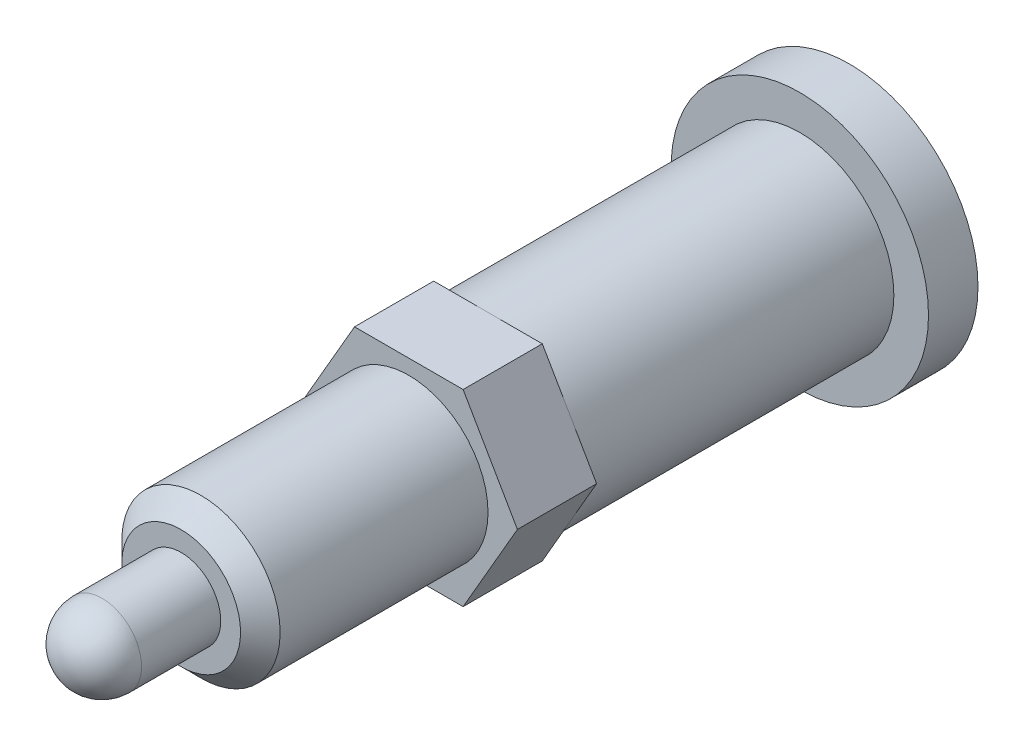
ISO-10303-21;
HEADER;
FILE_DESCRIPTION(('STEP AP214'),'2;1');
FILE_NAME('part.step','',(''),(''),'','','');
FILE_SCHEMA(('AUTOMOTIVE_DESIGN { 1 0 10303 214 1 1 1 1 }'));
ENDSEC;
DATA;
#1=APPLICATION_CONTEXT('core data for automotive mechanical design processes');
#2=APPLICATION_PROTOCOL_DEFINITION('international standard','automotive_design',2000,#1);
#3=PRODUCT_CONTEXT('',#1,'mechanical');
#4=PRODUCT('Part','Part','',(#3));
#5=PRODUCT_RELATED_PRODUCT_CATEGORY('part','',(#4));
#6=PRODUCT_DEFINITION_FORMATION('','',#4);
#7=PRODUCT_DEFINITION_CONTEXT('part definition',#1,'design');
#8=PRODUCT_DEFINITION('design','',#6,#7);
#9=PRODUCT_DEFINITION_SHAPE('','',#8);
#10=(LENGTH_UNIT() NAMED_UNIT(*) SI_UNIT(.MILLI.,.METRE.));
#11=(NAMED_UNIT(*) PLANE_ANGLE_UNIT() SI_UNIT($,.RADIAN.));
#12=(NAMED_UNIT(*) SI_UNIT($,.STERADIAN.) SOLID_ANGLE_UNIT());
#13=UNCERTAINTY_MEASURE_WITH_UNIT(LENGTH_MEASURE(1.E-05),#10,'distance_accuracy_value','');
#14=(GEOMETRIC_REPRESENTATION_CONTEXT(3) GLOBAL_UNCERTAINTY_ASSIGNED_CONTEXT((#13)) GLOBAL_UNIT_ASSIGNED_CONTEXT((#10,
#11,#12)) REPRESENTATION_CONTEXT('',''));
#15=CARTESIAN_POINT('',(0.,0.,0.));
#16=DIRECTION('',(0.,0.,1.));
#17=DIRECTION('',(1.,0.,0.));
#18=AXIS2_PLACEMENT_3D('',#15,#16,#17);
#19=CARTESIAN_POINT('',(0.,0.,0.));
#20=DIRECTION('',(0.,0.,1.));
#21=DIRECTION('',(-1.,0.,0.));
#22=AXIS2_PLACEMENT_3D('',#19,#20,#21);
#23=SPHERICAL_SURFACE('',#22,4.);
#24=CARTESIAN_POINT('',(0.,0.,0.));
#25=DIRECTION('',(0.,0.,1.));
#26=DIRECTION('',(1.,0.,0.));
#27=AXIS2_PLACEMENT_3D('',#24,#25,#26);
#28=CIRCLE('',#27,4.);
#29=CARTESIAN_POINT('',(4.,0.,0.));
#30=VERTEX_POINT('',#29);
#31=EDGE_CURVE('E187',#30,#30,#28,.T.);
#32=ORIENTED_EDGE('',*,*,#31,.T.);
#33=EDGE_LOOP('',(#32));
#34=FACE_BOUND('',#33,.T.);
#35=ADVANCED_FACE('F36',(#34),#23,.T.);
#36=CARTESIAN_POINT('',(0.,0.,0.));
#37=DIRECTION('',(0.,0.,1.));
#38=DIRECTION('',(1.,0.,0.));
#39=AXIS2_PLACEMENT_3D('',#36,#37,#38);
#40=CYLINDRICAL_SURFACE('',#39,4.);
#41=CARTESIAN_POINT('',(0.,0.,-8.));
#42=DIRECTION('',(0.,0.,1.));
#43=DIRECTION('',(1.,0.,0.));
#44=AXIS2_PLACEMENT_3D('',#41,#42,#43);
#45=CIRCLE('',#44,4.);
#46=CARTESIAN_POINT('',(4.,0.,-8.));
#47=VERTEX_POINT('',#46);
#48=EDGE_CURVE('E184',#47,#47,#45,.T.);
#49=ORIENTED_EDGE('',*,*,#48,.T.);
#50=EDGE_LOOP('',(#49));
#51=FACE_BOUND('',#50,.T.);
#52=ORIENTED_EDGE('',*,*,#31,.F.);
#53=EDGE_LOOP('',(#52));
#54=FACE_BOUND('',#53,.T.);
#55=ADVANCED_FACE('F246',(#51,#54),#40,.T.);
#56=CARTESIAN_POINT('',(4.,0.,-8.));
#57=DIRECTION('',(0.,0.,1.));
#58=DIRECTION('',(1.,0.,0.));
#59=AXIS2_PLACEMENT_3D('',#56,#57,#58);
#60=PLANE('',#59);
#61=CARTESIAN_POINT('',(0.,0.,-8.));
#62=DIRECTION('',(0.,0.,1.));
#63=DIRECTION('',(1.,0.,0.));
#64=AXIS2_PLACEMENT_3D('',#61,#62,#63);
#65=CIRCLE('',#64,5.99999999999999);
#66=CARTESIAN_POINT('',(5.99999999999999,0.,-8.));
#67=VERTEX_POINT('',#66);
#68=EDGE_CURVE('E44',#67,#67,#65,.T.);
#69=ORIENTED_EDGE('',*,*,#68,.T.);
#70=EDGE_LOOP('',(#69));
#71=FACE_BOUND('',#70,.T.);
#72=ORIENTED_EDGE('',*,*,#48,.F.);
#73=EDGE_LOOP('',(#72));
#74=FACE_BOUND('',#73,.T.);
#75=ADVANCED_FACE('F251',(#71,#74),#60,.T.);
#76=CARTESIAN_POINT('',(0.,0.,0.));
#77=DIRECTION('',(0.,0.,1.));
#78=DIRECTION('',(1.,0.,0.));
#79=AXIS2_PLACEMENT_3D('',#76,#77,#78);
#80=CYLINDRICAL_SURFACE('',#79,8.);
#81=CARTESIAN_POINT('',(0.,0.,-10.));
#82=DIRECTION('',(0.,0.,1.));
#83=DIRECTION('',(1.,0.,0.));
#84=AXIS2_PLACEMENT_3D('',#81,#82,#83);
#85=CIRCLE('',#84,8.);
#86=CARTESIAN_POINT('',(8.,0.,-10.));
#87=VERTEX_POINT('',#86);
#88=EDGE_CURVE('E11',#87,#87,#85,.F.);
#89=ORIENTED_EDGE('',*,*,#88,.T.);
#90=EDGE_LOOP('',(#89));
#91=FACE_BOUND('',#90,.T.);
#92=CARTESIAN_POINT('',(0.,0.,-31.));
#93=DIRECTION('',(0.,0.,1.));
#94=DIRECTION('',(1.,0.,0.));
#95=AXIS2_PLACEMENT_3D('',#92,#93,#94);
#96=CIRCLE('',#95,8.);
#97=CARTESIAN_POINT('',(8.,0.,-31.));
#98=VERTEX_POINT('',#97);
#99=EDGE_CURVE('E181',#98,#98,#96,.T.);
#100=ORIENTED_EDGE('',*,*,#99,.T.);
#101=EDGE_LOOP('',(#100));
#102=FACE_BOUND('',#101,.T.);
#103=ADVANCED_FACE('F257',(#91,#102),#80,.T.);
#104=CARTESIAN_POINT('',(8.,0.,-31.));
#105=DIRECTION('',(0.,0.,1.));
#106=DIRECTION('',(1.,0.,0.));
#107=AXIS2_PLACEMENT_3D('',#104,#105,#106);
#108=PLANE('',#107);
#109=DIRECTION('',(0.5,0.866025403784438,0.));
#110=VECTOR('',#109,1.);
#111=CARTESIAN_POINT('',(5.48482755730145,-9.49999999999999,-31.));
#112=LINE('',#111,#110);
#113=CARTESIAN_POINT('',(5.48482755730145,-9.49999999999999,-31.));
#114=VERTEX_POINT('',#113);
#115=CARTESIAN_POINT('',(10.9696551146029,0.,-31.));
#116=VERTEX_POINT('',#115);
#117=EDGE_CURVE('E146',#114,#116,#112,.T.);
#118=ORIENTED_EDGE('',*,*,#117,.T.);
#119=DIRECTION('',(-0.5,0.866025403784438,0.));
#120=VECTOR('',#119,1.);
#121=CARTESIAN_POINT('',(10.9696551146029,0.,-31.));
#122=LINE('',#121,#120);
#123=CARTESIAN_POINT('',(5.48482755730144,9.5,-31.));
#124=VERTEX_POINT('',#123);
#125=EDGE_CURVE('E123',#116,#124,#122,.T.);
#126=ORIENTED_EDGE('',*,*,#125,.T.);
#127=DIRECTION('',(-1.,0.,0.));
#128=VECTOR('',#127,1.);
#129=CARTESIAN_POINT('',(5.48482755730144,9.5,-31.));
#130=LINE('',#129,#128);
#131=CARTESIAN_POINT('',(-5.48482755730145,9.5,-31.));
#132=VERTEX_POINT('',#131);
#133=EDGE_CURVE('E149',#124,#132,#130,.T.);
#134=ORIENTED_EDGE('',*,*,#133,.T.);
#135=DIRECTION('',(-0.5,-0.866025403784439,0.));
#136=VECTOR('',#135,1.);
#137=CARTESIAN_POINT('',(-5.48482755730145,9.5,-31.));
#138=LINE('',#137,#136);
#139=CARTESIAN_POINT('',(-10.9696551146029,0.,-31.));
#140=VERTEX_POINT('',#139);
#141=EDGE_CURVE('E152',#132,#140,#138,.T.);
#142=ORIENTED_EDGE('',*,*,#141,.T.);
#143=DIRECTION('',(0.5,-0.866025403784439,0.));
#144=VECTOR('',#143,1.);
#145=CARTESIAN_POINT('',(-10.9696551146029,0.,-31.));
#146=LINE('',#145,#144);
#147=CARTESIAN_POINT('',(-5.48482755730145,-9.49999999999999,-31.));
#148=VERTEX_POINT('',#147);
#149=EDGE_CURVE('E155',#140,#148,#146,.T.);
#150=ORIENTED_EDGE('',*,*,#149,.T.);
#151=DIRECTION('',(1.,0.,0.));
#152=VECTOR('',#151,1.);
#153=CARTESIAN_POINT('',(-5.48482755730145,-9.49999999999999,-31.));
#154=LINE('',#153,#152);
#155=EDGE_CURVE('E113',#148,#114,#154,.T.);
#156=ORIENTED_EDGE('',*,*,#155,.T.);
#157=EDGE_LOOP('',(#118,#126,#134,#142,#150,#156));
#158=FACE_BOUND('',#157,.T.);
#159=ORIENTED_EDGE('',*,*,#99,.F.);
#160=EDGE_LOOP('',(#159));
#161=FACE_BOUND('',#160,.T.);
#162=ADVANCED_FACE('F217',(#158,#161),#108,.T.);
#163=CARTESIAN_POINT('',(5.48482755730145,-9.49999999999999,-39.));
#164=DIRECTION('',(0.866025403784439,-0.5,0.));
#165=DIRECTION('',(0.5,0.866025403784438,0.));
#166=AXIS2_PLACEMENT_3D('',#163,#164,#165);
#167=PLANE('',#166);
#168=DIRECTION('',(0.5,0.866025403784438,0.));
#169=VECTOR('',#168,1.);
#170=CARTESIAN_POINT('',(5.48482755730145,-9.49999999999999,-39.));
#171=LINE('',#170,#169);
#172=CARTESIAN_POINT('',(5.48482755730145,-9.49999999999999,-39.));
#173=VERTEX_POINT('',#172);
#174=CARTESIAN_POINT('',(8.22724133595217,-4.75,-39.));
#175=VERTEX_POINT('',#174);
#176=EDGE_CURVE('E51',#173,#175,#171,.T.);
#177=ORIENTED_EDGE('',*,*,#176,.T.);
#178=CARTESIAN_POINT('',(10.9696551146029,0.,-39.));
#179=VERTEX_POINT('',#178);
#180=EDGE_CURVE('E107',#175,#179,#171,.T.);
#181=ORIENTED_EDGE('',*,*,#180,.T.);
#182=DIRECTION('',(0.,0.,1.));
#183=VECTOR('',#182,1.);
#184=CARTESIAN_POINT('',(10.9696551146029,0.,-39.));
#185=LINE('',#184,#183);
#186=EDGE_CURVE('E111',#179,#116,#185,.T.);
#187=ORIENTED_EDGE('',*,*,#186,.T.);
#188=ORIENTED_EDGE('',*,*,#117,.F.);
#189=DIRECTION('',(0.,0.,1.));
#190=VECTOR('',#189,1.);
#191=CARTESIAN_POINT('',(5.48482755730145,-9.49999999999999,-39.));
#192=LINE('',#191,#190);
#193=EDGE_CURVE('E159',#173,#114,#192,.T.);
#194=ORIENTED_EDGE('',*,*,#193,.F.);
#195=EDGE_LOOP('',(#177,#181,#187,#188,#194));
#196=FACE_BOUND('',#195,.T.);
#197=ADVANCED_FACE('F109',(#196),#167,.T.);
#198=CARTESIAN_POINT('',(-5.48482755730145,-9.49999999999999,-39.));
#199=DIRECTION('',(0.,-1.,0.));
#200=DIRECTION('',(0.,0.,-1.));
#201=AXIS2_PLACEMENT_3D('',#198,#199,#200);
#202=PLANE('',#201);
#203=DIRECTION('',(1.,0.,0.));
#204=VECTOR('',#203,1.);
#205=CARTESIAN_POINT('',(-5.48482755730145,-9.49999999999999,-39.));
#206=LINE('',#205,#204);
#207=CARTESIAN_POINT('',(-5.48482755730145,-9.49999999999999,-39.));
#208=VERTEX_POINT('',#207);
#209=CARTESIAN_POINT('',(0.,-9.49999999999999,-39.));
#210=VERTEX_POINT('',#209);
#211=EDGE_CURVE('E125',#208,#210,#206,.T.);
#212=ORIENTED_EDGE('',*,*,#211,.T.);
#213=EDGE_CURVE('E143',#210,#173,#206,.T.);
#214=ORIENTED_EDGE('',*,*,#213,.T.);
#215=ORIENTED_EDGE('',*,*,#193,.T.);
#216=ORIENTED_EDGE('',*,*,#155,.F.);
#217=DIRECTION('',(0.,0.,1.));
#218=VECTOR('',#217,1.);
#219=CARTESIAN_POINT('',(-5.48482755730145,-9.49999999999999,-39.));
#220=LINE('',#219,#218);
#221=EDGE_CURVE('E163',#208,#148,#220,.T.);
#222=ORIENTED_EDGE('',*,*,#221,.F.);
#223=EDGE_LOOP('',(#212,#214,#215,#216,#222));
#224=FACE_BOUND('',#223,.T.);
#225=ADVANCED_FACE('F225',(#224),#202,.T.);
#226=CARTESIAN_POINT('',(-10.9696551146029,0.,-39.));
#227=DIRECTION('',(-0.866025403784439,-0.5,0.));
#228=DIRECTION('',(0.5,-0.866025403784439,0.));
#229=AXIS2_PLACEMENT_3D('',#226,#227,#228);
#230=PLANE('',#229);
#231=DIRECTION('',(0.5,-0.866025403784439,0.));
#232=VECTOR('',#231,1.);
#233=CARTESIAN_POINT('',(-10.9696551146029,0.,-39.));
#234=LINE('',#233,#232);
#235=CARTESIAN_POINT('',(-10.9696551146029,0.,-39.));
#236=VERTEX_POINT('',#235);
#237=CARTESIAN_POINT('',(-8.22724133595217,-4.75,-39.));
#238=VERTEX_POINT('',#237);
#239=EDGE_CURVE('E140',#236,#238,#234,.T.);
#240=ORIENTED_EDGE('',*,*,#239,.T.);
#241=EDGE_CURVE('E139',#238,#208,#234,.T.);
#242=ORIENTED_EDGE('',*,*,#241,.T.);
#243=ORIENTED_EDGE('',*,*,#221,.T.);
#244=ORIENTED_EDGE('',*,*,#149,.F.);
#245=DIRECTION('',(0.,0.,1.));
#246=VECTOR('',#245,1.);
#247=CARTESIAN_POINT('',(-10.9696551146029,0.,-39.));
#248=LINE('',#247,#246);
#249=EDGE_CURVE('E166',#236,#140,#248,.T.);
#250=ORIENTED_EDGE('',*,*,#249,.F.);
#251=EDGE_LOOP('',(#240,#242,#243,#244,#250));
#252=FACE_BOUND('',#251,.T.);
#253=ADVANCED_FACE('F232',(#252),#230,.T.);
#254=CARTESIAN_POINT('',(-5.48482755730145,9.5,-39.));
#255=DIRECTION('',(-0.866025403784439,0.5,0.));
#256=DIRECTION('',(-0.5,-0.866025403784439,0.));
#257=AXIS2_PLACEMENT_3D('',#254,#255,#256);
#258=PLANE('',#257);
#259=DIRECTION('',(-0.5,-0.866025403784439,0.));
#260=VECTOR('',#259,1.);
#261=CARTESIAN_POINT('',(-5.48482755730145,9.5,-39.));
#262=LINE('',#261,#260);
#263=CARTESIAN_POINT('',(-5.48482755730145,9.5,-39.));
#264=VERTEX_POINT('',#263);
#265=CARTESIAN_POINT('',(-8.22724133595217,4.75,-39.));
#266=VERTEX_POINT('',#265);
#267=EDGE_CURVE('E136',#264,#266,#262,.T.);
#268=ORIENTED_EDGE('',*,*,#267,.T.);
#269=EDGE_CURVE('E135',#266,#236,#262,.T.);
#270=ORIENTED_EDGE('',*,*,#269,.T.);
#271=ORIENTED_EDGE('',*,*,#249,.T.);
#272=ORIENTED_EDGE('',*,*,#141,.F.);
#273=DIRECTION('',(0.,0.,1.));
#274=VECTOR('',#273,1.);
#275=CARTESIAN_POINT('',(-5.48482755730145,9.5,-39.));
#276=LINE('',#275,#274);
#277=EDGE_CURVE('E169',#264,#132,#276,.T.);
#278=ORIENTED_EDGE('',*,*,#277,.F.);
#279=EDGE_LOOP('',(#268,#270,#271,#272,#278));
#280=FACE_BOUND('',#279,.T.);
#281=ADVANCED_FACE('F236',(#280),#258,.T.);
#282=CARTESIAN_POINT('',(5.48482755730144,9.5,-39.));
#283=DIRECTION('',(0.,1.,0.));
#284=DIRECTION('',(0.,0.,1.));
#285=AXIS2_PLACEMENT_3D('',#282,#283,#284);
#286=PLANE('',#285);
#287=DIRECTION('',(-1.,0.,0.));
#288=VECTOR('',#287,1.);
#289=CARTESIAN_POINT('',(5.48482755730144,9.5,-39.));
#290=LINE('',#289,#288);
#291=CARTESIAN_POINT('',(5.48482755730144,9.5,-39.));
#292=VERTEX_POINT('',#291);
#293=CARTESIAN_POINT('',(0.,9.5,-39.));
#294=VERTEX_POINT('',#293);
#295=EDGE_CURVE('E131',#292,#294,#290,.T.);
#296=ORIENTED_EDGE('',*,*,#295,.T.);
#297=EDGE_CURVE('E128',#294,#264,#290,.T.);
#298=ORIENTED_EDGE('',*,*,#297,.T.);
#299=ORIENTED_EDGE('',*,*,#277,.T.);
#300=ORIENTED_EDGE('',*,*,#133,.F.);
#301=DIRECTION('',(0.,0.,1.));
#302=VECTOR('',#301,1.);
#303=CARTESIAN_POINT('',(5.48482755730144,9.5,-39.));
#304=LINE('',#303,#302);
#305=EDGE_CURVE('E124',#292,#124,#304,.T.);
#306=ORIENTED_EDGE('',*,*,#305,.F.);
#307=EDGE_LOOP('',(#296,#298,#299,#300,#306));
#308=FACE_BOUND('',#307,.T.);
#309=ADVANCED_FACE('F215',(#308),#286,.T.);
#310=CARTESIAN_POINT('',(10.9696551146029,0.,-39.));
#311=DIRECTION('',(0.866025403784438,0.5,0.));
#312=DIRECTION('',(-0.5,0.866025403784439,0.));
#313=AXIS2_PLACEMENT_3D('',#310,#311,#312);
#314=PLANE('',#313);
#315=DIRECTION('',(-0.5,0.866025403784438,0.));
#316=VECTOR('',#315,1.);
#317=CARTESIAN_POINT('',(10.9696551146029,0.,-39.));
#318=LINE('',#317,#316);
#319=CARTESIAN_POINT('',(8.22724133595216,4.75,-39.));
#320=VERTEX_POINT('',#319);
#321=EDGE_CURVE('E119',#179,#320,#318,.T.);
#322=ORIENTED_EDGE('',*,*,#321,.T.);
#323=EDGE_CURVE('E129',#320,#292,#318,.T.);
#324=ORIENTED_EDGE('',*,*,#323,.T.);
#325=ORIENTED_EDGE('',*,*,#305,.T.);
#326=ORIENTED_EDGE('',*,*,#125,.F.);
#327=ORIENTED_EDGE('',*,*,#186,.F.);
#328=EDGE_LOOP('',(#322,#324,#325,#326,#327));
#329=FACE_BOUND('',#328,.T.);
#330=ADVANCED_FACE('F118',(#329),#314,.T.);
#331=CARTESIAN_POINT('',(0.,0.,-39.));
#332=DIRECTION('',(0.,0.,1.));
#333=DIRECTION('',(1.,0.,0.));
#334=AXIS2_PLACEMENT_3D('',#331,#332,#333);
#335=PLANE('',#334);
#336=CARTESIAN_POINT('',(0.,0.,-39.));
#337=DIRECTION('',(0.,0.,1.));
#338=DIRECTION('',(1.,0.,0.));
#339=AXIS2_PLACEMENT_3D('',#336,#337,#338);
#340=CIRCLE('',#339,9.5);
#341=EDGE_CURVE('E191',#175,#210,#340,.F.);
#342=ORIENTED_EDGE('',*,*,#341,.F.);
#343=ORIENTED_EDGE('',*,*,#176,.F.);
#344=ORIENTED_EDGE('',*,*,#213,.F.);
#345=EDGE_LOOP('',(#342,#343,#344));
#346=FACE_BOUND('',#345,.T.);
#347=ADVANCED_FACE('F222',(#346),#335,.F.);
#348=EDGE_CURVE('E196',#210,#238,#340,.F.);
#349=ORIENTED_EDGE('',*,*,#348,.F.);
#350=ORIENTED_EDGE('',*,*,#211,.F.);
#351=ORIENTED_EDGE('',*,*,#241,.F.);
#352=EDGE_LOOP('',(#349,#350,#351));
#353=FACE_BOUND('',#352,.T.);
#354=ADVANCED_FACE('F228',(#353),#335,.F.);
#355=EDGE_CURVE('E199',#238,#266,#340,.F.);
#356=ORIENTED_EDGE('',*,*,#355,.F.);
#357=ORIENTED_EDGE('',*,*,#239,.F.);
#358=ORIENTED_EDGE('',*,*,#269,.F.);
#359=EDGE_LOOP('',(#356,#357,#358));
#360=FACE_BOUND('',#359,.T.);
#361=ADVANCED_FACE('F234',(#360),#335,.F.);
#362=EDGE_CURVE('E201',#266,#294,#340,.F.);
#363=ORIENTED_EDGE('',*,*,#362,.F.);
#364=ORIENTED_EDGE('',*,*,#267,.F.);
#365=ORIENTED_EDGE('',*,*,#297,.F.);
#366=EDGE_LOOP('',(#363,#364,#365));
#367=FACE_BOUND('',#366,.T.);
#368=ADVANCED_FACE('F210',(#367),#335,.F.);
#369=EDGE_CURVE('E190',#294,#320,#340,.F.);
#370=ORIENTED_EDGE('',*,*,#369,.F.);
#371=ORIENTED_EDGE('',*,*,#295,.F.);
#372=ORIENTED_EDGE('',*,*,#323,.F.);
#373=EDGE_LOOP('',(#370,#371,#372));
#374=FACE_BOUND('',#373,.T.);
#375=ADVANCED_FACE('F207',(#374),#335,.F.);
#376=EDGE_CURVE('E58',#320,#175,#340,.F.);
#377=ORIENTED_EDGE('',*,*,#376,.F.);
#378=ORIENTED_EDGE('',*,*,#321,.F.);
#379=ORIENTED_EDGE('',*,*,#180,.F.);
#380=EDGE_LOOP('',(#377,#378,#379));
#381=FACE_BOUND('',#380,.T.);
#382=ADVANCED_FACE('F127',(#381),#335,.F.);
#383=CARTESIAN_POINT('',(0.,0.,8.49999999999992));
#384=DIRECTION('',(0.,0.,1.));
#385=DIRECTION('',(1.,0.,0.));
#386=AXIS2_PLACEMENT_3D('',#383,#384,#385);
#387=SPHERICAL_SURFACE('',#386,84.9999999999999);
#388=CARTESIAN_POINT('',(0.,0.,-75.5));
#389=DIRECTION('',(0.,0.,1.));
#390=DIRECTION('',(1.,0.,0.));
#391=AXIS2_PLACEMENT_3D('',#388,#389,#390);
#392=CIRCLE('',#391,13.);
#393=CARTESIAN_POINT('',(13.,0.,-75.5));
#394=VERTEX_POINT('',#393);
#395=EDGE_CURVE('E162',#394,#394,#392,.T.);
#396=ORIENTED_EDGE('',*,*,#395,.F.);
#397=EDGE_LOOP('',(#396));
#398=FACE_BOUND('',#397,.T.);
#399=ADVANCED_FACE('F273',(#398),#387,.T.);
#400=CARTESIAN_POINT('',(0.,0.,0.));
#401=DIRECTION('',(0.,0.,1.));
#402=DIRECTION('',(1.,0.,0.));
#403=AXIS2_PLACEMENT_3D('',#400,#401,#402);
#404=CYLINDRICAL_SURFACE('',#403,13.);
#405=ORIENTED_EDGE('',*,*,#395,.T.);
#406=EDGE_LOOP('',(#405));
#407=FACE_BOUND('',#406,.T.);
#408=CARTESIAN_POINT('',(0.,0.,-70.5));
#409=DIRECTION('',(0.,0.,1.));
#410=DIRECTION('',(1.,0.,0.));
#411=AXIS2_PLACEMENT_3D('',#408,#409,#410);
#412=CIRCLE('',#411,13.);
#413=CARTESIAN_POINT('',(13.,0.,-70.5));
#414=VERTEX_POINT('',#413);
#415=EDGE_CURVE('E175',#414,#414,#412,.T.);
#416=ORIENTED_EDGE('',*,*,#415,.F.);
#417=EDGE_LOOP('',(#416));
#418=FACE_BOUND('',#417,.T.);
#419=ADVANCED_FACE('F269',(#407,#418),#404,.T.);
#420=CARTESIAN_POINT('',(9.5,0.,-70.5));
#421=DIRECTION('',(0.,0.,1.));
#422=DIRECTION('',(1.,0.,0.));
#423=AXIS2_PLACEMENT_3D('',#420,#421,#422);
#424=PLANE('',#423);
#425=ORIENTED_EDGE('',*,*,#415,.T.);
#426=EDGE_LOOP('',(#425));
#427=FACE_BOUND('',#426,.T.);
#428=CARTESIAN_POINT('',(0.,0.,-70.5));
#429=DIRECTION('',(0.,0.,1.));
#430=DIRECTION('',(1.,0.,0.));
#431=AXIS2_PLACEMENT_3D('',#428,#429,#430);
#432=CIRCLE('',#431,9.5);
#433=CARTESIAN_POINT('',(9.5,0.,-70.5));
#434=VERTEX_POINT('',#433);
#435=EDGE_CURVE('E178',#434,#434,#432,.T.);
#436=ORIENTED_EDGE('',*,*,#435,.F.);
#437=EDGE_LOOP('',(#436));
#438=FACE_BOUND('',#437,.T.);
#439=ADVANCED_FACE('F265',(#427,#438),#424,.T.);
#440=CARTESIAN_POINT('',(0.,0.,0.));
#441=DIRECTION('',(0.,0.,1.));
#442=DIRECTION('',(1.,0.,0.));
#443=AXIS2_PLACEMENT_3D('',#440,#441,#442);
#444=CYLINDRICAL_SURFACE('',#443,9.5);
#445=ORIENTED_EDGE('',*,*,#435,.T.);
#446=EDGE_LOOP('',(#445));
#447=FACE_BOUND('',#446,.T.);
#448=ORIENTED_EDGE('',*,*,#376,.T.);
#449=ORIENTED_EDGE('',*,*,#341,.T.);
#450=ORIENTED_EDGE('',*,*,#348,.T.);
#451=ORIENTED_EDGE('',*,*,#355,.T.);
#452=ORIENTED_EDGE('',*,*,#362,.T.);
#453=ORIENTED_EDGE('',*,*,#369,.T.);
#454=EDGE_LOOP('',(#448,#449,#450,#451,#452,#453));
#455=FACE_BOUND('',#454,.T.);
#456=ADVANCED_FACE('F203',(#447,#455),#444,.T.);
#457=CARTESIAN_POINT('',(0.,0.,-8.));
#458=DIRECTION('',(0.,0.,-1.));
#459=DIRECTION('',(-1.,0.,0.));
#460=AXIS2_PLACEMENT_3D('',#457,#458,#459);
#461=CONICAL_SURFACE('',#460,5.99999999999999,0.785398163397448);
#462=ORIENTED_EDGE('',*,*,#88,.F.);
#463=EDGE_LOOP('',(#462));
#464=FACE_BOUND('',#463,.T.);
#465=ORIENTED_EDGE('',*,*,#68,.F.);
#466=EDGE_LOOP('',(#465));
#467=FACE_BOUND('',#466,.T.);
#468=ADVANCED_FACE('F38',(#464,#467),#461,.T.);
#469=CLOSED_SHELL('',(#35,#55,#75,#103,#162,#197,#225,#253,#281,#309,#330,#347,#354,#361,#368,
#375,#382,#399,#419,#439,#456,#468));
#470=MANIFOLD_SOLID_BREP('B2',#469);
#471=ADVANCED_BREP_SHAPE_REPRESENTATION('',(#18,#470),#14);
#472=SHAPE_DEFINITION_REPRESENTATION(#9,#471);
ENDSEC;
END-ISO-10303-21;
